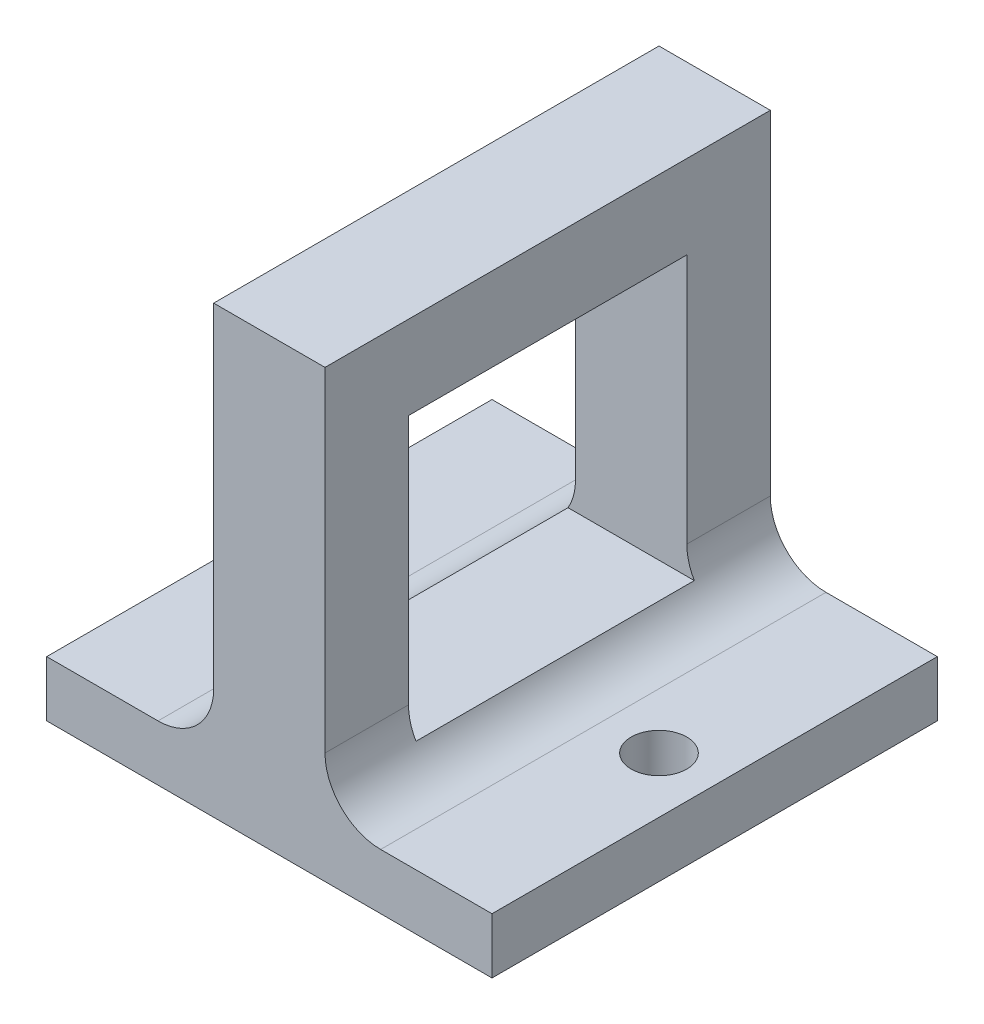
ISO-10303-21;
HEADER;
FILE_DESCRIPTION(('STEP AP214'),'2;1');
FILE_NAME('part.step','',(''),(''),'','','');
FILE_SCHEMA(('AUTOMOTIVE_DESIGN { 1 0 10303 214 1 1 1 1 }'));
ENDSEC;
DATA;
#1=APPLICATION_CONTEXT('core data for automotive mechanical design processes');
#2=APPLICATION_PROTOCOL_DEFINITION('international standard','automotive_design',2000,#1);
#3=PRODUCT_CONTEXT('',#1,'mechanical');
#4=PRODUCT('Part','Part','',(#3));
#5=PRODUCT_RELATED_PRODUCT_CATEGORY('part','',(#4));
#6=PRODUCT_DEFINITION_FORMATION('','',#4);
#7=PRODUCT_DEFINITION_CONTEXT('part definition',#1,'design');
#8=PRODUCT_DEFINITION('design','',#6,#7);
#9=PRODUCT_DEFINITION_SHAPE('','',#8);
#10=(LENGTH_UNIT() NAMED_UNIT(*) SI_UNIT(.MILLI.,.METRE.));
#11=(NAMED_UNIT(*) PLANE_ANGLE_UNIT() SI_UNIT($,.RADIAN.));
#12=(NAMED_UNIT(*) SI_UNIT($,.STERADIAN.) SOLID_ANGLE_UNIT());
#13=UNCERTAINTY_MEASURE_WITH_UNIT(LENGTH_MEASURE(1.E-05),#10,'distance_accuracy_value','');
#14=(GEOMETRIC_REPRESENTATION_CONTEXT(3) GLOBAL_UNCERTAINTY_ASSIGNED_CONTEXT((#13)) GLOBAL_UNIT_ASSIGNED_CONTEXT((#10,
#11,#12)) REPRESENTATION_CONTEXT('',''));
#15=CARTESIAN_POINT('',(0.,0.,0.));
#16=DIRECTION('',(0.,0.,1.));
#17=DIRECTION('',(1.,0.,0.));
#18=AXIS2_PLACEMENT_3D('',#15,#16,#17);
#19=CARTESIAN_POINT('',(6.35,0.,0.));
#20=DIRECTION('',(-1.,0.,0.));
#21=DIRECTION('',(0.,0.,1.));
#22=AXIS2_PLACEMENT_3D('',#19,#20,#21);
#23=PLANE('',#22);
#24=DIRECTION('',(0.,-1.,0.));
#25=VECTOR('',#24,1.);
#26=CARTESIAN_POINT('',(6.35,-25.4,25.4));
#27=LINE('',#26,#25);
#28=CARTESIAN_POINT('',(6.35,25.4,25.4));
#29=VERTEX_POINT('',#28);
#30=CARTESIAN_POINT('',(6.35,-12.7,25.4));
#31=VERTEX_POINT('',#30);
#32=EDGE_CURVE('E224',#29,#31,#27,.T.);
#33=ORIENTED_EDGE('',*,*,#32,.T.);
#34=DIRECTION('',(0.,0.,1.));
#35=VECTOR('',#34,1.);
#36=CARTESIAN_POINT('',(6.35,-12.7,-25.4));
#37=LINE('',#36,#35);
#38=CARTESIAN_POINT('',(6.35,-12.7,15.875));
#39=VERTEX_POINT('',#38);
#40=EDGE_CURVE('E250',#31,#39,#37,.F.);
#41=ORIENTED_EDGE('',*,*,#40,.T.);
#42=DIRECTION('',(0.,-1.,0.));
#43=VECTOR('',#42,1.);
#44=CARTESIAN_POINT('',(6.35,-15.875,15.875));
#45=LINE('',#44,#43);
#46=CARTESIAN_POINT('',(6.35,15.875,15.875));
#47=VERTEX_POINT('',#46);
#48=EDGE_CURVE('E202',#47,#39,#45,.T.);
#49=ORIENTED_EDGE('',*,*,#48,.F.);
#50=DIRECTION('',(0.,0.,1.));
#51=VECTOR('',#50,1.);
#52=CARTESIAN_POINT('',(6.35,15.875,15.875));
#53=LINE('',#52,#51);
#54=CARTESIAN_POINT('',(6.35,15.875,-15.875));
#55=VERTEX_POINT('',#54);
#56=EDGE_CURVE('E199',#55,#47,#53,.T.);
#57=ORIENTED_EDGE('',*,*,#56,.F.);
#58=DIRECTION('',(0.,1.,0.));
#59=VECTOR('',#58,1.);
#60=CARTESIAN_POINT('',(6.35,-15.875,-15.875));
#61=LINE('',#60,#59);
#62=CARTESIAN_POINT('',(6.35,-12.7,-15.875));
#63=VERTEX_POINT('',#62);
#64=EDGE_CURVE('E197',#63,#55,#61,.T.);
#65=ORIENTED_EDGE('',*,*,#64,.F.);
#66=DIRECTION('',(0.,0.,1.));
#67=VECTOR('',#66,1.);
#68=CARTESIAN_POINT('',(6.35,-12.7,-25.4));
#69=LINE('',#68,#67);
#70=CARTESIAN_POINT('',(6.35,-12.7,-25.4));
#71=VERTEX_POINT('',#70);
#72=EDGE_CURVE('E248',#63,#71,#69,.F.);
#73=ORIENTED_EDGE('',*,*,#72,.T.);
#74=DIRECTION('',(0.,1.,0.));
#75=VECTOR('',#74,1.);
#76=CARTESIAN_POINT('',(6.35,-25.4,-25.4));
#77=LINE('',#76,#75);
#78=CARTESIAN_POINT('',(6.35,25.4,-25.4));
#79=VERTEX_POINT('',#78);
#80=EDGE_CURVE('E219',#71,#79,#77,.T.);
#81=ORIENTED_EDGE('',*,*,#80,.T.);
#82=DIRECTION('',(0.,0.,1.));
#83=VECTOR('',#82,1.);
#84=CARTESIAN_POINT('',(6.35,25.4,25.4));
#85=LINE('',#84,#83);
#86=EDGE_CURVE('E221',#79,#29,#85,.T.);
#87=ORIENTED_EDGE('',*,*,#86,.T.);
#88=EDGE_LOOP('',(#33,#41,#49,#57,#65,#73,#81,#87));
#89=FACE_BOUND('',#88,.T.);
#90=ADVANCED_FACE('F35',(#89),#23,.F.);
#91=CARTESIAN_POINT('',(-6.35,0.,0.));
#92=DIRECTION('',(-1.,0.,0.));
#93=DIRECTION('',(0.,0.,1.));
#94=AXIS2_PLACEMENT_3D('',#91,#92,#93);
#95=PLANE('',#94);
#96=DIRECTION('',(0.,1.,0.));
#97=VECTOR('',#96,1.);
#98=CARTESIAN_POINT('',(-6.35,-25.4,-25.4));
#99=LINE('',#98,#97);
#100=CARTESIAN_POINT('',(-6.35,-12.7,-25.4));
#101=VERTEX_POINT('',#100);
#102=CARTESIAN_POINT('',(-6.35,25.4,-25.4));
#103=VERTEX_POINT('',#102);
#104=EDGE_CURVE('E218',#101,#103,#99,.T.);
#105=ORIENTED_EDGE('',*,*,#104,.F.);
#106=DIRECTION('',(0.,0.,1.));
#107=VECTOR('',#106,1.);
#108=CARTESIAN_POINT('',(-6.35,-12.7,0.));
#109=LINE('',#108,#107);
#110=CARTESIAN_POINT('',(-6.35,-12.7,-15.875));
#111=VERTEX_POINT('',#110);
#112=EDGE_CURVE('E240',#101,#111,#109,.T.);
#113=ORIENTED_EDGE('',*,*,#112,.T.);
#114=DIRECTION('',(0.,1.,0.));
#115=VECTOR('',#114,1.);
#116=CARTESIAN_POINT('',(-6.35,-15.875,-15.875));
#117=LINE('',#116,#115);
#118=CARTESIAN_POINT('',(-6.35,15.875,-15.875));
#119=VERTEX_POINT('',#118);
#120=EDGE_CURVE('E196',#111,#119,#117,.T.);
#121=ORIENTED_EDGE('',*,*,#120,.T.);
#122=DIRECTION('',(0.,0.,1.));
#123=VECTOR('',#122,1.);
#124=CARTESIAN_POINT('',(-6.35,15.875,15.875));
#125=LINE('',#124,#123);
#126=CARTESIAN_POINT('',(-6.35,15.875,15.875));
#127=VERTEX_POINT('',#126);
#128=EDGE_CURVE('E206',#119,#127,#125,.T.);
#129=ORIENTED_EDGE('',*,*,#128,.T.);
#130=DIRECTION('',(0.,-1.,0.));
#131=VECTOR('',#130,1.);
#132=CARTESIAN_POINT('',(-6.35,-15.875,15.875));
#133=LINE('',#132,#131);
#134=CARTESIAN_POINT('',(-6.35,-12.7,15.875));
#135=VERTEX_POINT('',#134);
#136=EDGE_CURVE('E200',#127,#135,#133,.T.);
#137=ORIENTED_EDGE('',*,*,#136,.T.);
#138=DIRECTION('',(0.,0.,1.));
#139=VECTOR('',#138,1.);
#140=CARTESIAN_POINT('',(-6.35,-12.7,0.));
#141=LINE('',#140,#139);
#142=CARTESIAN_POINT('',(-6.35,-12.7,25.4));
#143=VERTEX_POINT('',#142);
#144=EDGE_CURVE('E238',#135,#143,#141,.T.);
#145=ORIENTED_EDGE('',*,*,#144,.T.);
#146=DIRECTION('',(0.,-1.,0.));
#147=VECTOR('',#146,1.);
#148=CARTESIAN_POINT('',(-6.35,-25.4,25.4));
#149=LINE('',#148,#147);
#150=CARTESIAN_POINT('',(-6.35,25.4,25.4));
#151=VERTEX_POINT('',#150);
#152=EDGE_CURVE('E222',#151,#143,#149,.T.);
#153=ORIENTED_EDGE('',*,*,#152,.F.);
#154=DIRECTION('',(0.,0.,1.));
#155=VECTOR('',#154,1.);
#156=CARTESIAN_POINT('',(-6.35,25.4,25.4));
#157=LINE('',#156,#155);
#158=EDGE_CURVE('E228',#103,#151,#157,.T.);
#159=ORIENTED_EDGE('',*,*,#158,.F.);
#160=EDGE_LOOP('',(#105,#113,#121,#129,#137,#145,#153,#159));
#161=FACE_BOUND('',#160,.T.);
#162=ADVANCED_FACE('F302',(#161),#95,.T.);
#163=CARTESIAN_POINT('',(6.35,-25.4,-25.4));
#164=DIRECTION('',(0.,0.,1.));
#165=DIRECTION('',(0.,-1.,0.));
#166=AXIS2_PLACEMENT_3D('',#163,#164,#165);
#167=PLANE('',#166);
#168=DIRECTION('',(-1.,0.,0.));
#169=VECTOR('',#168,1.);
#170=CARTESIAN_POINT('',(6.35,-25.4,-25.4));
#171=LINE('',#170,#169);
#172=CARTESIAN_POINT('',(25.4,-25.4,-25.4));
#173=VERTEX_POINT('',#172);
#174=CARTESIAN_POINT('',(-25.4,-25.4,-25.4));
#175=VERTEX_POINT('',#174);
#176=EDGE_CURVE('E159',#173,#175,#171,.T.);
#177=ORIENTED_EDGE('',*,*,#176,.T.);
#178=DIRECTION('',(0.,1.,0.));
#179=VECTOR('',#178,1.);
#180=CARTESIAN_POINT('',(-25.4,-25.4,-25.4));
#181=LINE('',#180,#179);
#182=CARTESIAN_POINT('',(-25.4,-19.05,-25.4));
#183=VERTEX_POINT('',#182);
#184=EDGE_CURVE('E175',#175,#183,#181,.T.);
#185=ORIENTED_EDGE('',*,*,#184,.T.);
#186=DIRECTION('',(-1.,0.,0.));
#187=VECTOR('',#186,1.);
#188=CARTESIAN_POINT('',(25.4,-19.05,-25.4));
#189=LINE('',#188,#187);
#190=CARTESIAN_POINT('',(-12.7,-19.05,-25.4));
#191=VERTEX_POINT('',#190);
#192=EDGE_CURVE('E192',#191,#183,#189,.T.);
#193=ORIENTED_EDGE('',*,*,#192,.F.);
#194=CARTESIAN_POINT('',(-12.7,-12.7,-25.4));
#195=DIRECTION('',(0.,0.,1.));
#196=DIRECTION('',(0.,-1.,0.));
#197=AXIS2_PLACEMENT_3D('',#194,#195,#196);
#198=CIRCLE('',#197,6.35);
#199=EDGE_CURVE('E260',#191,#101,#198,.T.);
#200=ORIENTED_EDGE('',*,*,#199,.T.);
#201=ORIENTED_EDGE('',*,*,#104,.T.);
#202=DIRECTION('',(-1.,0.,0.));
#203=VECTOR('',#202,1.);
#204=CARTESIAN_POINT('',(6.35,25.4,-25.4));
#205=LINE('',#204,#203);
#206=EDGE_CURVE('E235',#79,#103,#205,.T.);
#207=ORIENTED_EDGE('',*,*,#206,.F.);
#208=ORIENTED_EDGE('',*,*,#80,.F.);
#209=CARTESIAN_POINT('',(12.7,-12.7,-25.4));
#210=DIRECTION('',(0.,0.,1.));
#211=DIRECTION('',(0.,-1.,0.));
#212=AXIS2_PLACEMENT_3D('',#209,#210,#211);
#213=CIRCLE('',#212,6.35);
#214=CARTESIAN_POINT('',(12.7,-19.05,-25.4));
#215=VERTEX_POINT('',#214);
#216=EDGE_CURVE('E11',#71,#215,#213,.T.);
#217=ORIENTED_EDGE('',*,*,#216,.T.);
#218=CARTESIAN_POINT('',(25.4,-19.05,-25.4));
#219=VERTEX_POINT('',#218);
#220=EDGE_CURVE('E193',#219,#215,#189,.T.);
#221=ORIENTED_EDGE('',*,*,#220,.F.);
#222=DIRECTION('',(0.,1.,0.));
#223=VECTOR('',#222,1.);
#224=CARTESIAN_POINT('',(25.4,-25.4,-25.4));
#225=LINE('',#224,#223);
#226=EDGE_CURVE('E166',#173,#219,#225,.T.);
#227=ORIENTED_EDGE('',*,*,#226,.F.);
#228=EDGE_LOOP('',(#177,#185,#193,#200,#201,#207,#208,#217,#221,#227));
#229=FACE_BOUND('',#228,.T.);
#230=ADVANCED_FACE('F284',(#229),#167,.F.);
#231=CARTESIAN_POINT('',(6.35,25.4,25.4));
#232=DIRECTION('',(0.,-1.,0.));
#233=DIRECTION('',(0.,0.,-1.));
#234=AXIS2_PLACEMENT_3D('',#231,#232,#233);
#235=PLANE('',#234);
#236=ORIENTED_EDGE('',*,*,#158,.T.);
#237=DIRECTION('',(-1.,0.,0.));
#238=VECTOR('',#237,1.);
#239=CARTESIAN_POINT('',(6.35,25.4,25.4));
#240=LINE('',#239,#238);
#241=EDGE_CURVE('E158',#29,#151,#240,.T.);
#242=ORIENTED_EDGE('',*,*,#241,.F.);
#243=ORIENTED_EDGE('',*,*,#86,.F.);
#244=ORIENTED_EDGE('',*,*,#206,.T.);
#245=EDGE_LOOP('',(#236,#242,#243,#244));
#246=FACE_BOUND('',#245,.T.);
#247=ADVANCED_FACE('F338',(#246),#235,.F.);
#248=CARTESIAN_POINT('',(6.35,-25.4,25.4));
#249=DIRECTION('',(0.,0.,-1.));
#250=DIRECTION('',(0.,1.,0.));
#251=AXIS2_PLACEMENT_3D('',#248,#249,#250);
#252=PLANE('',#251);
#253=DIRECTION('',(-1.,0.,0.));
#254=VECTOR('',#253,1.);
#255=CARTESIAN_POINT('',(6.35,-25.4,25.4));
#256=LINE('',#255,#254);
#257=CARTESIAN_POINT('',(25.4,-25.4,25.4));
#258=VERTEX_POINT('',#257);
#259=CARTESIAN_POINT('',(-25.4,-25.4,25.4));
#260=VERTEX_POINT('',#259);
#261=EDGE_CURVE('E147',#258,#260,#256,.T.);
#262=ORIENTED_EDGE('',*,*,#261,.F.);
#263=DIRECTION('',(0.,-1.,0.));
#264=VECTOR('',#263,1.);
#265=CARTESIAN_POINT('',(25.4,-25.4,25.4));
#266=LINE('',#265,#264);
#267=CARTESIAN_POINT('',(25.4,-19.05,25.4));
#268=VERTEX_POINT('',#267);
#269=EDGE_CURVE('E152',#268,#258,#266,.T.);
#270=ORIENTED_EDGE('',*,*,#269,.F.);
#271=DIRECTION('',(-1.,0.,0.));
#272=VECTOR('',#271,1.);
#273=CARTESIAN_POINT('',(25.4,-19.05,25.4));
#274=LINE('',#273,#272);
#275=CARTESIAN_POINT('',(12.7,-19.05,25.4));
#276=VERTEX_POINT('',#275);
#277=EDGE_CURVE('E190',#268,#276,#274,.T.);
#278=ORIENTED_EDGE('',*,*,#277,.T.);
#279=CARTESIAN_POINT('',(12.7,-12.7,25.4));
#280=DIRECTION('',(0.,0.,-1.));
#281=DIRECTION('',(0.,1.,0.));
#282=AXIS2_PLACEMENT_3D('',#279,#280,#281);
#283=CIRCLE('',#282,6.35);
#284=EDGE_CURVE('E262',#276,#31,#283,.T.);
#285=ORIENTED_EDGE('',*,*,#284,.T.);
#286=ORIENTED_EDGE('',*,*,#32,.F.);
#287=ORIENTED_EDGE('',*,*,#241,.T.);
#288=ORIENTED_EDGE('',*,*,#152,.T.);
#289=CARTESIAN_POINT('',(-12.7,-12.7,25.4));
#290=DIRECTION('',(0.,0.,-1.));
#291=DIRECTION('',(0.,1.,0.));
#292=AXIS2_PLACEMENT_3D('',#289,#290,#291);
#293=CIRCLE('',#292,6.35);
#294=CARTESIAN_POINT('',(-12.7,-19.05,25.4));
#295=VERTEX_POINT('',#294);
#296=EDGE_CURVE('E258',#143,#295,#293,.T.);
#297=ORIENTED_EDGE('',*,*,#296,.T.);
#298=CARTESIAN_POINT('',(-25.4,-19.05,25.4));
#299=VERTEX_POINT('',#298);
#300=EDGE_CURVE('E183',#295,#299,#274,.T.);
#301=ORIENTED_EDGE('',*,*,#300,.T.);
#302=DIRECTION('',(0.,-1.,0.));
#303=VECTOR('',#302,1.);
#304=CARTESIAN_POINT('',(-25.4,-25.4,25.4));
#305=LINE('',#304,#303);
#306=EDGE_CURVE('E154',#299,#260,#305,.T.);
#307=ORIENTED_EDGE('',*,*,#306,.T.);
#308=EDGE_LOOP('',(#262,#270,#278,#285,#286,#287,#288,#297,#301,#307));
#309=FACE_BOUND('',#308,.T.);
#310=ADVANCED_FACE('F149',(#309),#252,.F.);
#311=CARTESIAN_POINT('',(6.35,-25.4,25.4));
#312=DIRECTION('',(0.,1.,0.));
#313=DIRECTION('',(0.,0.,1.));
#314=AXIS2_PLACEMENT_3D('',#311,#312,#313);
#315=PLANE('',#314);
#316=CARTESIAN_POINT('',(-19.05,-25.4,0.));
#317=DIRECTION('',(0.,-1.,0.));
#318=DIRECTION('',(0.,0.,1.));
#319=AXIS2_PLACEMENT_3D('',#316,#317,#318);
#320=CIRCLE('',#319,3.175);
#321=CARTESIAN_POINT('',(-19.05,-25.4,3.175));
#322=VERTEX_POINT('',#321);
#323=EDGE_CURVE('E371',#322,#322,#320,.T.);
#324=ORIENTED_EDGE('',*,*,#323,.F.);
#325=EDGE_LOOP('',(#324));
#326=FACE_BOUND('',#325,.T.);
#327=CARTESIAN_POINT('',(19.05,-25.4,0.));
#328=DIRECTION('',(0.,1.,0.));
#329=DIRECTION('',(0.,0.,1.));
#330=AXIS2_PLACEMENT_3D('',#327,#328,#329);
#331=CIRCLE('',#330,3.175);
#332=CARTESIAN_POINT('',(19.05,-25.4,3.175));
#333=VERTEX_POINT('',#332);
#334=EDGE_CURVE('E186',#333,#333,#331,.T.);
#335=ORIENTED_EDGE('',*,*,#334,.T.);
#336=EDGE_LOOP('',(#335));
#337=FACE_BOUND('',#336,.T.);
#338=ORIENTED_EDGE('',*,*,#261,.T.);
#339=DIRECTION('',(0.,0.,-1.));
#340=VECTOR('',#339,1.);
#341=CARTESIAN_POINT('',(-25.4,-25.4,25.4));
#342=LINE('',#341,#340);
#343=EDGE_CURVE('E185',#260,#175,#342,.T.);
#344=ORIENTED_EDGE('',*,*,#343,.T.);
#345=ORIENTED_EDGE('',*,*,#176,.F.);
#346=DIRECTION('',(0.,0.,-1.));
#347=VECTOR('',#346,1.);
#348=CARTESIAN_POINT('',(25.4,-25.4,25.4));
#349=LINE('',#348,#347);
#350=EDGE_CURVE('E162',#258,#173,#349,.T.);
#351=ORIENTED_EDGE('',*,*,#350,.F.);
#352=EDGE_LOOP('',(#338,#344,#345,#351));
#353=FACE_BOUND('',#352,.T.);
#354=ADVANCED_FACE('F163',(#326,#337,#353),#315,.F.);
#355=CARTESIAN_POINT('',(6.35,-15.875,-15.875));
#356=DIRECTION('',(0.,0.,1.));
#357=DIRECTION('',(1.,0.,0.));
#358=AXIS2_PLACEMENT_3D('',#355,#356,#357);
#359=PLANE('',#358);
#360=ORIENTED_EDGE('',*,*,#120,.F.);
#361=CARTESIAN_POINT('',(-12.7,-12.7,-15.875));
#362=DIRECTION('',(0.,0.,1.));
#363=DIRECTION('',(1.,0.,0.));
#364=AXIS2_PLACEMENT_3D('',#361,#362,#363);
#365=CIRCLE('',#364,6.35);
#366=CARTESIAN_POINT('',(-7.20073868596881,-15.875,-15.875));
#367=VERTEX_POINT('',#366);
#368=EDGE_CURVE('E252',#111,#367,#365,.F.);
#369=ORIENTED_EDGE('',*,*,#368,.T.);
#370=DIRECTION('',(-1.,0.,0.));
#371=VECTOR('',#370,1.);
#372=CARTESIAN_POINT('',(6.35,-15.875,-15.875));
#373=LINE('',#372,#371);
#374=CARTESIAN_POINT('',(7.20073868596881,-15.875,-15.875));
#375=VERTEX_POINT('',#374);
#376=EDGE_CURVE('E50',#375,#367,#373,.T.);
#377=ORIENTED_EDGE('',*,*,#376,.F.);
#378=CARTESIAN_POINT('',(12.7,-12.7,-15.875));
#379=DIRECTION('',(0.,0.,1.));
#380=DIRECTION('',(1.,0.,0.));
#381=AXIS2_PLACEMENT_3D('',#378,#379,#380);
#382=CIRCLE('',#381,6.35);
#383=EDGE_CURVE('E43',#375,#63,#382,.F.);
#384=ORIENTED_EDGE('',*,*,#383,.T.);
#385=ORIENTED_EDGE('',*,*,#64,.T.);
#386=DIRECTION('',(-1.,0.,0.));
#387=VECTOR('',#386,1.);
#388=CARTESIAN_POINT('',(6.35,15.875,-15.875));
#389=LINE('',#388,#387);
#390=EDGE_CURVE('E215',#55,#119,#389,.T.);
#391=ORIENTED_EDGE('',*,*,#390,.T.);
#392=EDGE_LOOP('',(#360,#369,#377,#384,#385,#391));
#393=FACE_BOUND('',#392,.T.);
#394=ADVANCED_FACE('F270',(#393),#359,.T.);
#395=CARTESIAN_POINT('',(6.35,15.875,15.875));
#396=DIRECTION('',(0.,-1.,0.));
#397=DIRECTION('',(0.,0.,-1.));
#398=AXIS2_PLACEMENT_3D('',#395,#396,#397);
#399=PLANE('',#398);
#400=ORIENTED_EDGE('',*,*,#128,.F.);
#401=ORIENTED_EDGE('',*,*,#390,.F.);
#402=ORIENTED_EDGE('',*,*,#56,.T.);
#403=DIRECTION('',(-1.,0.,0.));
#404=VECTOR('',#403,1.);
#405=CARTESIAN_POINT('',(6.35,15.875,15.875));
#406=LINE('',#405,#404);
#407=EDGE_CURVE('E213',#47,#127,#406,.T.);
#408=ORIENTED_EDGE('',*,*,#407,.T.);
#409=EDGE_LOOP('',(#400,#401,#402,#408));
#410=FACE_BOUND('',#409,.T.);
#411=ADVANCED_FACE('F298',(#410),#399,.T.);
#412=CARTESIAN_POINT('',(6.35,-15.875,15.875));
#413=DIRECTION('',(0.,0.,-1.));
#414=DIRECTION('',(-1.,0.,0.));
#415=AXIS2_PLACEMENT_3D('',#412,#413,#414);
#416=PLANE('',#415);
#417=ORIENTED_EDGE('',*,*,#136,.F.);
#418=ORIENTED_EDGE('',*,*,#407,.F.);
#419=ORIENTED_EDGE('',*,*,#48,.T.);
#420=CARTESIAN_POINT('',(12.7,-12.7,15.875));
#421=DIRECTION('',(0.,0.,-1.));
#422=DIRECTION('',(-1.,0.,0.));
#423=AXIS2_PLACEMENT_3D('',#420,#421,#422);
#424=CIRCLE('',#423,6.35);
#425=CARTESIAN_POINT('',(7.20073868596881,-15.875,15.875));
#426=VERTEX_POINT('',#425);
#427=EDGE_CURVE('E264',#39,#426,#424,.F.);
#428=ORIENTED_EDGE('',*,*,#427,.T.);
#429=DIRECTION('',(-1.,0.,0.));
#430=VECTOR('',#429,1.);
#431=CARTESIAN_POINT('',(6.35,-15.875,15.875));
#432=LINE('',#431,#430);
#433=CARTESIAN_POINT('',(-7.20073868596881,-15.875,15.875));
#434=VERTEX_POINT('',#433);
#435=EDGE_CURVE('E57',#426,#434,#432,.T.);
#436=ORIENTED_EDGE('',*,*,#435,.T.);
#437=CARTESIAN_POINT('',(-12.7,-12.7,15.875));
#438=DIRECTION('',(0.,0.,-1.));
#439=DIRECTION('',(-1.,0.,0.));
#440=AXIS2_PLACEMENT_3D('',#437,#438,#439);
#441=CIRCLE('',#440,6.35);
#442=EDGE_CURVE('E256',#434,#135,#441,.F.);
#443=ORIENTED_EDGE('',*,*,#442,.T.);
#444=EDGE_LOOP('',(#417,#418,#419,#428,#436,#443));
#445=FACE_BOUND('',#444,.T.);
#446=ADVANCED_FACE('F294',(#445),#416,.T.);
#447=CARTESIAN_POINT('',(6.35,-15.875,15.875));
#448=DIRECTION('',(0.,1.,0.));
#449=DIRECTION('',(0.,0.,1.));
#450=AXIS2_PLACEMENT_3D('',#447,#448,#449);
#451=PLANE('',#450);
#452=ORIENTED_EDGE('',*,*,#376,.T.);
#453=DIRECTION('',(0.,0.,1.));
#454=VECTOR('',#453,1.);
#455=CARTESIAN_POINT('',(-7.20073868596881,-15.875,-15.875));
#456=LINE('',#455,#454);
#457=EDGE_CURVE('E254',#367,#434,#456,.T.);
#458=ORIENTED_EDGE('',*,*,#457,.T.);
#459=ORIENTED_EDGE('',*,*,#435,.F.);
#460=DIRECTION('',(0.,0.,-1.));
#461=VECTOR('',#460,1.);
#462=CARTESIAN_POINT('',(7.20073868596881,-15.875,15.875));
#463=LINE('',#462,#461);
#464=EDGE_CURVE('E266',#426,#375,#463,.T.);
#465=ORIENTED_EDGE('',*,*,#464,.T.);
#466=EDGE_LOOP('',(#452,#458,#459,#465));
#467=FACE_BOUND('',#466,.T.);
#468=ADVANCED_FACE('F311',(#467),#451,.T.);
#469=CARTESIAN_POINT('',(-25.4,0.,0.));
#470=DIRECTION('',(-1.,0.,0.));
#471=DIRECTION('',(0.,0.,1.));
#472=AXIS2_PLACEMENT_3D('',#469,#470,#471);
#473=PLANE('',#472);
#474=ORIENTED_EDGE('',*,*,#306,.F.);
#475=DIRECTION('',(0.,0.,1.));
#476=VECTOR('',#475,1.);
#477=CARTESIAN_POINT('',(-25.4,-19.05,25.4));
#478=LINE('',#477,#476);
#479=EDGE_CURVE('E172',#183,#299,#478,.T.);
#480=ORIENTED_EDGE('',*,*,#479,.F.);
#481=ORIENTED_EDGE('',*,*,#184,.F.);
#482=ORIENTED_EDGE('',*,*,#343,.F.);
#483=EDGE_LOOP('',(#474,#480,#481,#482));
#484=FACE_BOUND('',#483,.T.);
#485=ADVANCED_FACE('F313',(#484),#473,.T.);
#486=CARTESIAN_POINT('',(25.4,-19.05,25.4));
#487=DIRECTION('',(0.,-1.,0.));
#488=DIRECTION('',(0.,0.,-1.));
#489=AXIS2_PLACEMENT_3D('',#486,#487,#488);
#490=PLANE('',#489);
#491=CARTESIAN_POINT('',(-19.05,-19.05,0.));
#492=DIRECTION('',(0.,-1.,0.));
#493=DIRECTION('',(0.,0.,1.));
#494=AXIS2_PLACEMENT_3D('',#491,#492,#493);
#495=CIRCLE('',#494,3.175);
#496=CARTESIAN_POINT('',(-19.05,-19.05,3.175));
#497=VERTEX_POINT('',#496);
#498=EDGE_CURVE('E363',#497,#497,#495,.T.);
#499=ORIENTED_EDGE('',*,*,#498,.T.);
#500=EDGE_LOOP('',(#499));
#501=FACE_BOUND('',#500,.T.);
#502=ORIENTED_EDGE('',*,*,#300,.F.);
#503=DIRECTION('',(0.,0.,1.));
#504=VECTOR('',#503,1.);
#505=CARTESIAN_POINT('',(-12.7,-19.05,25.4));
#506=LINE('',#505,#504);
#507=EDGE_CURVE('E243',#295,#191,#506,.F.);
#508=ORIENTED_EDGE('',*,*,#507,.T.);
#509=ORIENTED_EDGE('',*,*,#192,.T.);
#510=ORIENTED_EDGE('',*,*,#479,.T.);
#511=EDGE_LOOP('',(#502,#508,#509,#510));
#512=FACE_BOUND('',#511,.T.);
#513=ADVANCED_FACE('F319',(#501,#512),#490,.F.);
#514=CARTESIAN_POINT('',(19.05,-19.05,0.));
#515=DIRECTION('',(0.,1.,0.));
#516=DIRECTION('',(0.,0.,1.));
#517=AXIS2_PLACEMENT_3D('',#514,#515,#516);
#518=CIRCLE('',#517,3.175);
#519=CARTESIAN_POINT('',(19.05,-19.05,3.175));
#520=VERTEX_POINT('',#519);
#521=EDGE_CURVE('E178',#520,#520,#518,.T.);
#522=ORIENTED_EDGE('',*,*,#521,.F.);
#523=EDGE_LOOP('',(#522));
#524=FACE_BOUND('',#523,.T.);
#525=ORIENTED_EDGE('',*,*,#220,.T.);
#526=DIRECTION('',(0.,0.,1.));
#527=VECTOR('',#526,1.);
#528=CARTESIAN_POINT('',(12.7,-19.05,25.4));
#529=LINE('',#528,#527);
#530=EDGE_CURVE('E245',#215,#276,#529,.T.);
#531=ORIENTED_EDGE('',*,*,#530,.T.);
#532=ORIENTED_EDGE('',*,*,#277,.F.);
#533=DIRECTION('',(0.,0.,1.));
#534=VECTOR('',#533,1.);
#535=CARTESIAN_POINT('',(25.4,-19.05,25.4));
#536=LINE('',#535,#534);
#537=EDGE_CURVE('E170',#219,#268,#536,.T.);
#538=ORIENTED_EDGE('',*,*,#537,.F.);
#539=EDGE_LOOP('',(#525,#531,#532,#538));
#540=FACE_BOUND('',#539,.T.);
#541=ADVANCED_FACE('F287',(#524,#540),#490,.F.);
#542=CARTESIAN_POINT('',(25.4,0.,0.));
#543=DIRECTION('',(-1.,0.,0.));
#544=DIRECTION('',(0.,0.,1.));
#545=AXIS2_PLACEMENT_3D('',#542,#543,#544);
#546=PLANE('',#545);
#547=ORIENTED_EDGE('',*,*,#269,.T.);
#548=ORIENTED_EDGE('',*,*,#350,.T.);
#549=ORIENTED_EDGE('',*,*,#226,.T.);
#550=ORIENTED_EDGE('',*,*,#537,.T.);
#551=EDGE_LOOP('',(#547,#548,#549,#550));
#552=FACE_BOUND('',#551,.T.);
#553=ADVANCED_FACE('F168',(#552),#546,.F.);
#554=CARTESIAN_POINT('',(-12.7,-12.7,0.));
#555=DIRECTION('',(0.,0.,1.));
#556=DIRECTION('',(1.,0.,0.));
#557=AXIS2_PLACEMENT_3D('',#554,#555,#556);
#558=CYLINDRICAL_SURFACE('',#557,6.35);
#559=ORIENTED_EDGE('',*,*,#199,.F.);
#560=ORIENTED_EDGE('',*,*,#507,.F.);
#561=ORIENTED_EDGE('',*,*,#296,.F.);
#562=ORIENTED_EDGE('',*,*,#144,.F.);
#563=ORIENTED_EDGE('',*,*,#442,.F.);
#564=ORIENTED_EDGE('',*,*,#457,.F.);
#565=ORIENTED_EDGE('',*,*,#368,.F.);
#566=ORIENTED_EDGE('',*,*,#112,.F.);
#567=EDGE_LOOP('',(#559,#560,#561,#562,#563,#564,#565,#566));
#568=FACE_BOUND('',#567,.T.);
#569=ADVANCED_FACE('F307',(#568),#558,.F.);
#570=CARTESIAN_POINT('',(12.7,-12.7,25.4));
#571=DIRECTION('',(0.,0.,-1.));
#572=DIRECTION('',(-1.,0.,0.));
#573=AXIS2_PLACEMENT_3D('',#570,#571,#572);
#574=CYLINDRICAL_SURFACE('',#573,6.35);
#575=ORIENTED_EDGE('',*,*,#427,.F.);
#576=ORIENTED_EDGE('',*,*,#40,.F.);
#577=ORIENTED_EDGE('',*,*,#284,.F.);
#578=ORIENTED_EDGE('',*,*,#530,.F.);
#579=ORIENTED_EDGE('',*,*,#216,.F.);
#580=ORIENTED_EDGE('',*,*,#72,.F.);
#581=ORIENTED_EDGE('',*,*,#383,.F.);
#582=ORIENTED_EDGE('',*,*,#464,.F.);
#583=EDGE_LOOP('',(#575,#576,#577,#578,#579,#580,#581,#582));
#584=FACE_BOUND('',#583,.T.);
#585=ADVANCED_FACE('F37',(#584),#574,.F.);
#586=CARTESIAN_POINT('',(19.05,-25.4,0.));
#587=DIRECTION('',(0.,1.,0.));
#588=DIRECTION('',(0.,0.,1.));
#589=AXIS2_PLACEMENT_3D('',#586,#587,#588);
#590=CYLINDRICAL_SURFACE('',#589,3.175);
#591=ORIENTED_EDGE('',*,*,#334,.F.);
#592=EDGE_LOOP('',(#591));
#593=FACE_BOUND('',#592,.T.);
#594=ORIENTED_EDGE('',*,*,#521,.T.);
#595=EDGE_LOOP('',(#594));
#596=FACE_BOUND('',#595,.T.);
#597=ADVANCED_FACE('F348',(#593,#596),#590,.F.);
#598=CARTESIAN_POINT('',(-19.05,-25.4,0.));
#599=DIRECTION('',(0.,1.,0.));
#600=DIRECTION('',(0.,0.,1.));
#601=AXIS2_PLACEMENT_3D('',#598,#599,#600);
#602=CYLINDRICAL_SURFACE('',#601,3.175);
#603=ORIENTED_EDGE('',*,*,#323,.T.);
#604=EDGE_LOOP('',(#603));
#605=FACE_BOUND('',#604,.T.);
#606=ORIENTED_EDGE('',*,*,#498,.F.);
#607=EDGE_LOOP('',(#606));
#608=FACE_BOUND('',#607,.T.);
#609=ADVANCED_FACE('F382',(#605,#608),#602,.F.);
#610=CLOSED_SHELL('',(#90,#162,#230,#247,#310,#354,#394,#411,#446,#468,#485,#513,#541,#553,#569,
#585,#597,#609));
#611=MANIFOLD_SOLID_BREP('B2',#610);
#612=ADVANCED_BREP_SHAPE_REPRESENTATION('',(#18,#611),#14);
#613=SHAPE_DEFINITION_REPRESENTATION(#9,#612);
ENDSEC;
END-ISO-10303-21;
